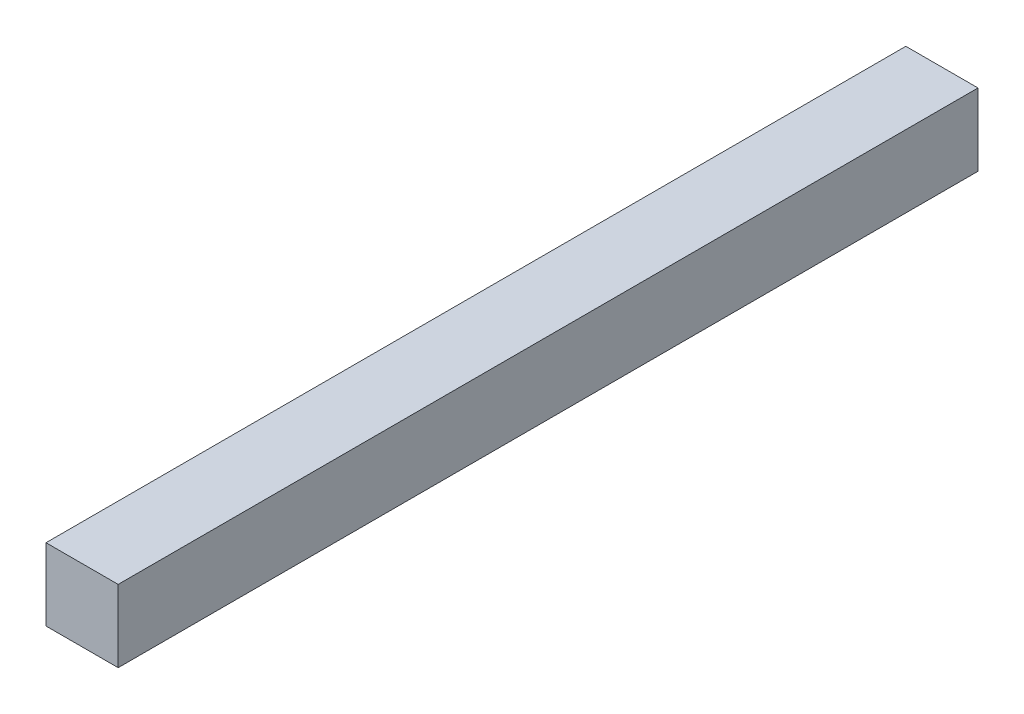
ISO-10303-21;
HEADER;
FILE_DESCRIPTION(('STEP AP214'),'2;1');
FILE_NAME('part.step','',(''),(''),'','','');
FILE_SCHEMA(('AUTOMOTIVE_DESIGN { 1 0 10303 214 1 1 1 1 }'));
ENDSEC;
DATA;
#1=APPLICATION_CONTEXT('core data for automotive mechanical design processes');
#2=APPLICATION_PROTOCOL_DEFINITION('international standard','automotive_design',2000,#1);
#3=PRODUCT_CONTEXT('',#1,'mechanical');
#4=PRODUCT('Part','Part','',(#3));
#5=PRODUCT_RELATED_PRODUCT_CATEGORY('part','',(#4));
#6=PRODUCT_DEFINITION_FORMATION('','',#4);
#7=PRODUCT_DEFINITION_CONTEXT('part definition',#1,'design');
#8=PRODUCT_DEFINITION('design','',#6,#7);
#9=PRODUCT_DEFINITION_SHAPE('','',#8);
#10=(LENGTH_UNIT() NAMED_UNIT(*) SI_UNIT(.MILLI.,.METRE.));
#11=(NAMED_UNIT(*) PLANE_ANGLE_UNIT() SI_UNIT($,.RADIAN.));
#12=(NAMED_UNIT(*) SI_UNIT($,.STERADIAN.) SOLID_ANGLE_UNIT());
#13=UNCERTAINTY_MEASURE_WITH_UNIT(LENGTH_MEASURE(1.E-05),#10,'distance_accuracy_value','');
#14=(GEOMETRIC_REPRESENTATION_CONTEXT(3) GLOBAL_UNCERTAINTY_ASSIGNED_CONTEXT((#13)) GLOBAL_UNIT_ASSIGNED_CONTEXT((#10,
#11,#12)) REPRESENTATION_CONTEXT('',''));
#15=CARTESIAN_POINT('',(0.,0.,0.));
#16=DIRECTION('',(0.,0.,1.));
#17=DIRECTION('',(1.,0.,0.));
#18=AXIS2_PLACEMENT_3D('',#15,#16,#17);
#19=CARTESIAN_POINT('',(2.34999999999999,-2.35,56.));
#20=DIRECTION('',(-1.,0.,0.));
#21=DIRECTION('',(0.,0.,1.));
#22=AXIS2_PLACEMENT_3D('',#19,#20,#21);
#23=PLANE('',#22);
#24=DIRECTION('',(0.,1.,0.));
#25=VECTOR('',#24,1.);
#26=CARTESIAN_POINT('',(2.34999999999999,-2.35,0.));
#27=LINE('',#26,#25);
#28=CARTESIAN_POINT('',(2.34999999999999,-2.35,0.));
#29=VERTEX_POINT('',#28);
#30=CARTESIAN_POINT('',(2.34999999999999,2.35,0.));
#31=VERTEX_POINT('',#30);
#32=EDGE_CURVE('E100',#29,#31,#27,.T.);
#33=ORIENTED_EDGE('',*,*,#32,.T.);
#34=DIRECTION('',(0.,0.,-1.));
#35=VECTOR('',#34,1.);
#36=CARTESIAN_POINT('',(2.34999999999999,2.35,56.));
#37=LINE('',#36,#35);
#38=CARTESIAN_POINT('',(2.34999999999999,2.35,56.));
#39=VERTEX_POINT('',#38);
#40=EDGE_CURVE('E11',#39,#31,#37,.T.);
#41=ORIENTED_EDGE('',*,*,#40,.F.);
#42=DIRECTION('',(0.,1.,0.));
#43=VECTOR('',#42,1.);
#44=CARTESIAN_POINT('',(2.34999999999999,-2.35,56.));
#45=LINE('',#44,#43);
#46=CARTESIAN_POINT('',(2.34999999999999,-2.35,56.));
#47=VERTEX_POINT('',#46);
#48=EDGE_CURVE('E88',#47,#39,#45,.T.);
#49=ORIENTED_EDGE('',*,*,#48,.F.);
#50=DIRECTION('',(0.,0.,-1.));
#51=VECTOR('',#50,1.);
#52=CARTESIAN_POINT('',(2.34999999999999,-2.35,56.));
#53=LINE('',#52,#51);
#54=EDGE_CURVE('E96',#47,#29,#53,.T.);
#55=ORIENTED_EDGE('',*,*,#54,.T.);
#56=EDGE_LOOP('',(#33,#41,#49,#55));
#57=FACE_BOUND('',#56,.T.);
#58=ADVANCED_FACE('F37',(#57),#23,.F.);
#59=CARTESIAN_POINT('',(-2.35,2.35,56.));
#60=DIRECTION('',(0.,-1.,0.));
#61=DIRECTION('',(0.,0.,-1.));
#62=AXIS2_PLACEMENT_3D('',#59,#60,#61);
#63=PLANE('',#62);
#64=DIRECTION('',(-1.,0.,0.));
#65=VECTOR('',#64,1.);
#66=CARTESIAN_POINT('',(-2.35,2.35,0.));
#67=LINE('',#66,#65);
#68=CARTESIAN_POINT('',(-2.35,2.35,0.));
#69=VERTEX_POINT('',#68);
#70=EDGE_CURVE('E92',#31,#69,#67,.T.);
#71=ORIENTED_EDGE('',*,*,#70,.T.);
#72=DIRECTION('',(0.,0.,-1.));
#73=VECTOR('',#72,1.);
#74=CARTESIAN_POINT('',(-2.35,2.35,56.));
#75=LINE('',#74,#73);
#76=CARTESIAN_POINT('',(-2.35,2.35,56.));
#77=VERTEX_POINT('',#76);
#78=EDGE_CURVE('E45',#77,#69,#75,.T.);
#79=ORIENTED_EDGE('',*,*,#78,.F.);
#80=DIRECTION('',(-1.,0.,0.));
#81=VECTOR('',#80,1.);
#82=CARTESIAN_POINT('',(-2.35,2.35,56.));
#83=LINE('',#82,#81);
#84=EDGE_CURVE('E83',#39,#77,#83,.T.);
#85=ORIENTED_EDGE('',*,*,#84,.F.);
#86=ORIENTED_EDGE('',*,*,#40,.T.);
#87=EDGE_LOOP('',(#71,#79,#85,#86));
#88=FACE_BOUND('',#87,.T.);
#89=ADVANCED_FACE('F91',(#88),#63,.F.);
#90=CARTESIAN_POINT('',(-2.35,-2.35,56.));
#91=DIRECTION('',(1.,0.,0.));
#92=DIRECTION('',(0.,0.,-1.));
#93=AXIS2_PLACEMENT_3D('',#90,#91,#92);
#94=PLANE('',#93);
#95=DIRECTION('',(0.,-1.,0.));
#96=VECTOR('',#95,1.);
#97=CARTESIAN_POINT('',(-2.35,-2.35,0.));
#98=LINE('',#97,#96);
#99=CARTESIAN_POINT('',(-2.35,-2.35,0.));
#100=VERTEX_POINT('',#99);
#101=EDGE_CURVE('E70',#69,#100,#98,.T.);
#102=ORIENTED_EDGE('',*,*,#101,.T.);
#103=DIRECTION('',(0.,0.,-1.));
#104=VECTOR('',#103,1.);
#105=CARTESIAN_POINT('',(-2.35,-2.35,56.));
#106=LINE('',#105,#104);
#107=CARTESIAN_POINT('',(-2.35,-2.35,56.));
#108=VERTEX_POINT('',#107);
#109=EDGE_CURVE('E93',#108,#100,#106,.T.);
#110=ORIENTED_EDGE('',*,*,#109,.F.);
#111=DIRECTION('',(0.,-1.,0.));
#112=VECTOR('',#111,1.);
#113=CARTESIAN_POINT('',(-2.35,-2.35,56.));
#114=LINE('',#113,#112);
#115=EDGE_CURVE('E86',#77,#108,#114,.T.);
#116=ORIENTED_EDGE('',*,*,#115,.F.);
#117=ORIENTED_EDGE('',*,*,#78,.T.);
#118=EDGE_LOOP('',(#102,#110,#116,#117));
#119=FACE_BOUND('',#118,.T.);
#120=ADVANCED_FACE('F94',(#119),#94,.F.);
#121=CARTESIAN_POINT('',(-2.35,-2.35,56.));
#122=DIRECTION('',(0.,1.,0.));
#123=DIRECTION('',(0.,0.,1.));
#124=AXIS2_PLACEMENT_3D('',#121,#122,#123);
#125=PLANE('',#124);
#126=DIRECTION('',(1.,0.,0.));
#127=VECTOR('',#126,1.);
#128=CARTESIAN_POINT('',(-2.35,-2.35,0.));
#129=LINE('',#128,#127);
#130=EDGE_CURVE('E76',#100,#29,#129,.T.);
#131=ORIENTED_EDGE('',*,*,#130,.T.);
#132=ORIENTED_EDGE('',*,*,#54,.F.);
#133=DIRECTION('',(1.,0.,0.));
#134=VECTOR('',#133,1.);
#135=CARTESIAN_POINT('',(-2.35,-2.35,56.));
#136=LINE('',#135,#134);
#137=EDGE_CURVE('E53',#108,#47,#136,.T.);
#138=ORIENTED_EDGE('',*,*,#137,.F.);
#139=ORIENTED_EDGE('',*,*,#109,.T.);
#140=EDGE_LOOP('',(#131,#132,#138,#139));
#141=FACE_BOUND('',#140,.T.);
#142=ADVANCED_FACE('F107',(#141),#125,.F.);
#143=CARTESIAN_POINT('',(0.,0.,56.));
#144=DIRECTION('',(0.,0.,-1.));
#145=DIRECTION('',(-1.,0.,0.));
#146=AXIS2_PLACEMENT_3D('',#143,#144,#145);
#147=PLANE('',#146);
#148=ORIENTED_EDGE('',*,*,#48,.T.);
#149=ORIENTED_EDGE('',*,*,#84,.T.);
#150=ORIENTED_EDGE('',*,*,#115,.T.);
#151=ORIENTED_EDGE('',*,*,#137,.T.);
#152=EDGE_LOOP('',(#148,#149,#150,#151));
#153=FACE_BOUND('',#152,.T.);
#154=ADVANCED_FACE('F84',(#153),#147,.F.);
#155=CARTESIAN_POINT('',(0.,0.,0.));
#156=DIRECTION('',(0.,0.,-1.));
#157=DIRECTION('',(-1.,0.,0.));
#158=AXIS2_PLACEMENT_3D('',#155,#156,#157);
#159=PLANE('',#158);
#160=ORIENTED_EDGE('',*,*,#32,.F.);
#161=ORIENTED_EDGE('',*,*,#130,.F.);
#162=ORIENTED_EDGE('',*,*,#101,.F.);
#163=ORIENTED_EDGE('',*,*,#70,.F.);
#164=EDGE_LOOP('',(#160,#161,#162,#163));
#165=FACE_BOUND('',#164,.T.);
#166=ADVANCED_FACE('F110',(#165),#159,.T.);
#167=CLOSED_SHELL('',(#58,#89,#120,#142,#154,#166));
#168=MANIFOLD_SOLID_BREP('B2',#167);
#169=ADVANCED_BREP_SHAPE_REPRESENTATION('',(#18,#168),#14);
#170=SHAPE_DEFINITION_REPRESENTATION(#9,#169);
ENDSEC;
END-ISO-10303-21;
